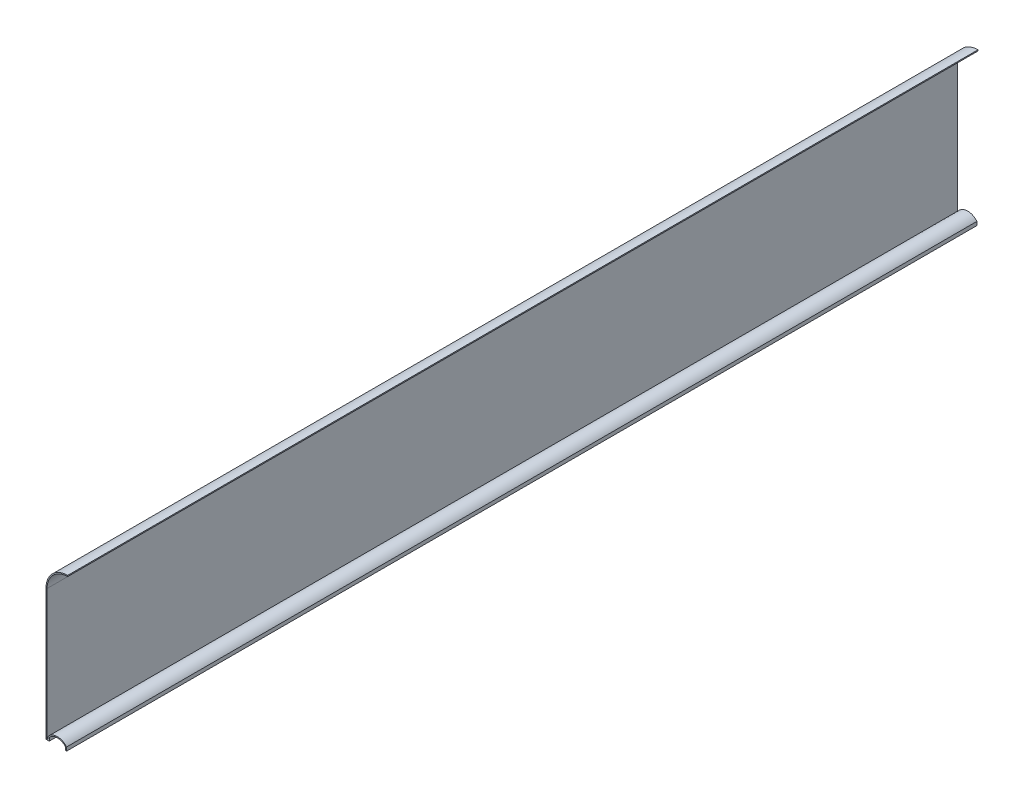
ISO-10303-21;
HEADER;
FILE_DESCRIPTION(('STEP AP214'),'2;1');
FILE_NAME('part.step','',(''),(''),'','','');
FILE_SCHEMA(('AUTOMOTIVE_DESIGN { 1 0 10303 214 1 1 1 1 }'));
ENDSEC;
DATA;
#1=APPLICATION_CONTEXT('core data for automotive mechanical design processes');
#2=APPLICATION_PROTOCOL_DEFINITION('international standard','automotive_design',2000,#1);
#3=PRODUCT_CONTEXT('',#1,'mechanical');
#4=PRODUCT('Part','Part','',(#3));
#5=PRODUCT_RELATED_PRODUCT_CATEGORY('part','',(#4));
#6=PRODUCT_DEFINITION_FORMATION('','',#4);
#7=PRODUCT_DEFINITION_CONTEXT('part definition',#1,'design');
#8=PRODUCT_DEFINITION('design','',#6,#7);
#9=PRODUCT_DEFINITION_SHAPE('','',#8);
#10=(LENGTH_UNIT() NAMED_UNIT(*) SI_UNIT(.MILLI.,.METRE.));
#11=(NAMED_UNIT(*) PLANE_ANGLE_UNIT() SI_UNIT($,.RADIAN.));
#12=(NAMED_UNIT(*) SI_UNIT($,.STERADIAN.) SOLID_ANGLE_UNIT());
#13=UNCERTAINTY_MEASURE_WITH_UNIT(LENGTH_MEASURE(1.E-05),#10,'distance_accuracy_value','');
#14=(GEOMETRIC_REPRESENTATION_CONTEXT(3) GLOBAL_UNCERTAINTY_ASSIGNED_CONTEXT((#13)) GLOBAL_UNIT_ASSIGNED_CONTEXT((#10,
#11,#12)) REPRESENTATION_CONTEXT('',''));
#15=CARTESIAN_POINT('',(0.,0.,0.));
#16=DIRECTION('',(0.,0.,1.));
#17=DIRECTION('',(1.,0.,0.));
#18=AXIS2_PLACEMENT_3D('',#15,#16,#17);
#19=CARTESIAN_POINT('',(1.7993799518643,0.,0.));
#20=DIRECTION('',(0.,0.,-1.));
#21=DIRECTION('',(0.,-1.,0.));
#22=AXIS2_PLACEMENT_3D('',#19,#20,#21);
#23=PLANE('',#22);
#24=DIRECTION('',(0.,-1.,0.));
#25=VECTOR('',#24,1.);
#26=CARTESIAN_POINT('',(1.7993799518643,0.,0.));
#27=LINE('',#26,#25);
#28=CARTESIAN_POINT('',(1.7993799518643,0.3,0.));
#29=VERTEX_POINT('',#28);
#30=CARTESIAN_POINT('',(1.7993799518643,0.,0.));
#31=VERTEX_POINT('',#30);
#32=EDGE_CURVE('E191',#29,#31,#27,.T.);
#33=ORIENTED_EDGE('',*,*,#32,.F.);
#34=CARTESIAN_POINT('',(1.04968997593215,-0.361789196033641,0.));
#35=DIRECTION('',(0.,0.,-1.));
#36=DIRECTION('',(-1.,0.,0.));
#37=AXIS2_PLACEMENT_3D('',#34,#35,#36);
#38=CIRCLE('',#37,1.);
#39=CARTESIAN_POINT('',(0.3,0.3,0.));
#40=VERTEX_POINT('',#39);
#41=EDGE_CURVE('E178',#40,#29,#38,.T.);
#42=ORIENTED_EDGE('',*,*,#41,.F.);
#43=DIRECTION('',(0.,1.,0.));
#44=VECTOR('',#43,1.);
#45=CARTESIAN_POINT('',(0.3,0.,0.));
#46=LINE('',#45,#44);
#47=CARTESIAN_POINT('',(0.3,0.,0.));
#48=VERTEX_POINT('',#47);
#49=EDGE_CURVE('E173',#48,#40,#46,.T.);
#50=ORIENTED_EDGE('',*,*,#49,.F.);
#51=DIRECTION('',(1.,0.,0.));
#52=VECTOR('',#51,1.);
#53=CARTESIAN_POINT('',(0.,0.,0.));
#54=LINE('',#53,#52);
#55=CARTESIAN_POINT('',(0.,0.,0.));
#56=VERTEX_POINT('',#55);
#57=EDGE_CURVE('E188',#56,#48,#54,.T.);
#58=ORIENTED_EDGE('',*,*,#57,.F.);
#59=DIRECTION('',(0.,-1.,0.));
#60=VECTOR('',#59,1.);
#61=CARTESIAN_POINT('',(0.,0.,0.));
#62=LINE('',#61,#60);
#63=CARTESIAN_POINT('',(0.,12.1,0.));
#64=VERTEX_POINT('',#63);
#65=EDGE_CURVE('E167',#64,#56,#62,.T.);
#66=ORIENTED_EDGE('',*,*,#65,.F.);
#67=CARTESIAN_POINT('',(2.,12.1,0.));
#68=DIRECTION('',(0.,0.,1.));
#69=DIRECTION('',(-1.,0.,0.));
#70=AXIS2_PLACEMENT_3D('',#67,#68,#69);
#71=CIRCLE('',#70,2.);
#72=CARTESIAN_POINT('',(2.,14.1,0.));
#73=VERTEX_POINT('',#72);
#74=EDGE_CURVE('E125',#73,#64,#71,.T.);
#75=ORIENTED_EDGE('',*,*,#74,.F.);
#76=DIRECTION('',(0.,1.,0.));
#77=VECTOR('',#76,1.);
#78=CARTESIAN_POINT('',(2.,14.1,0.));
#79=LINE('',#78,#77);
#80=CARTESIAN_POINT('',(2.,14.,0.));
#81=VERTEX_POINT('',#80);
#82=EDGE_CURVE('E11',#81,#73,#79,.T.);
#83=ORIENTED_EDGE('',*,*,#82,.F.);
#84=CARTESIAN_POINT('',(2.,12.1,0.));
#85=DIRECTION('',(0.,0.,1.));
#86=DIRECTION('',(1.,0.,0.));
#87=AXIS2_PLACEMENT_3D('',#84,#85,#86);
#88=CIRCLE('',#87,1.9);
#89=CARTESIAN_POINT('',(0.1,12.1,0.));
#90=VERTEX_POINT('',#89);
#91=EDGE_CURVE('E121',#81,#90,#88,.T.);
#92=ORIENTED_EDGE('',*,*,#91,.T.);
#93=DIRECTION('',(0.,1.,0.));
#94=VECTOR('',#93,1.);
#95=CARTESIAN_POINT('',(0.1,0.,0.));
#96=LINE('',#95,#94);
#97=CARTESIAN_POINT('',(0.1,0.1,0.));
#98=VERTEX_POINT('',#97);
#99=EDGE_CURVE('E146',#90,#98,#96,.F.);
#100=ORIENTED_EDGE('',*,*,#99,.T.);
#101=DIRECTION('',(1.,0.,0.));
#102=VECTOR('',#101,1.);
#103=CARTESIAN_POINT('',(0.,0.1,0.));
#104=LINE('',#103,#102);
#105=CARTESIAN_POINT('',(0.2,0.1,0.));
#106=VERTEX_POINT('',#105);
#107=EDGE_CURVE('E205',#98,#106,#104,.T.);
#108=ORIENTED_EDGE('',*,*,#107,.T.);
#109=DIRECTION('',(0.,1.,0.));
#110=VECTOR('',#109,1.);
#111=CARTESIAN_POINT('',(0.2,0.,0.));
#112=LINE('',#111,#110);
#113=CARTESIAN_POINT('',(0.2,0.336800057247873,0.));
#114=VERTEX_POINT('',#113);
#115=EDGE_CURVE('E209',#106,#114,#112,.T.);
#116=ORIENTED_EDGE('',*,*,#115,.T.);
#117=CARTESIAN_POINT('',(1.04968997593215,-0.361789196033641,0.));
#118=DIRECTION('',(0.,0.,1.));
#119=DIRECTION('',(1.,0.,0.));
#120=AXIS2_PLACEMENT_3D('',#117,#118,#119);
#121=CIRCLE('',#120,1.1);
#122=CARTESIAN_POINT('',(1.8993799518643,0.336800057247873,0.));
#123=VERTEX_POINT('',#122);
#124=EDGE_CURVE('E213',#114,#123,#121,.F.);
#125=ORIENTED_EDGE('',*,*,#124,.T.);
#126=DIRECTION('',(0.,1.,0.));
#127=VECTOR('',#126,1.);
#128=CARTESIAN_POINT('',(1.8993799518643,0.,0.));
#129=LINE('',#128,#127);
#130=CARTESIAN_POINT('',(1.8993799518643,0.,0.));
#131=VERTEX_POINT('',#130);
#132=EDGE_CURVE('E217',#123,#131,#129,.F.);
#133=ORIENTED_EDGE('',*,*,#132,.T.);
#134=DIRECTION('',(-1.,0.,0.));
#135=VECTOR('',#134,1.);
#136=CARTESIAN_POINT('',(1.7993799518643,0.,0.));
#137=LINE('',#136,#135);
#138=EDGE_CURVE('E44',#131,#31,#137,.T.);
#139=ORIENTED_EDGE('',*,*,#138,.T.);
#140=EDGE_LOOP('',(#33,#42,#50,#58,#66,#75,#83,#92,#100,#108,#116,#125,#133,#139));
#141=FACE_BOUND('',#140,.T.);
#142=ADVANCED_FACE('F34',(#141),#23,.T.);
#143=CARTESIAN_POINT('',(1.7993799518643,0.,0.));
#144=DIRECTION('',(0.,-1.,0.));
#145=DIRECTION('',(0.,0.,1.));
#146=AXIS2_PLACEMENT_3D('',#143,#144,#145);
#147=PLANE('',#146);
#148=ORIENTED_EDGE('',*,*,#138,.F.);
#149=DIRECTION('',(0.,0.,1.));
#150=VECTOR('',#149,1.);
#151=CARTESIAN_POINT('',(1.8993799518643,0.,0.));
#152=LINE('',#151,#150);
#153=CARTESIAN_POINT('',(1.8993799518643,0.,84.));
#154=VERTEX_POINT('',#153);
#155=EDGE_CURVE('E228',#131,#154,#152,.T.);
#156=ORIENTED_EDGE('',*,*,#155,.T.);
#157=DIRECTION('',(-1.,0.,0.));
#158=VECTOR('',#157,1.);
#159=CARTESIAN_POINT('',(1.7993799518643,0.,84.));
#160=LINE('',#159,#158);
#161=CARTESIAN_POINT('',(1.7993799518643,0.,84.));
#162=VERTEX_POINT('',#161);
#163=EDGE_CURVE('E149',#154,#162,#160,.T.);
#164=ORIENTED_EDGE('',*,*,#163,.T.);
#165=DIRECTION('',(0.,0.,1.));
#166=VECTOR('',#165,1.);
#167=CARTESIAN_POINT('',(1.7993799518643,0.,0.));
#168=LINE('',#167,#166);
#169=EDGE_CURVE('E182',#31,#162,#168,.T.);
#170=ORIENTED_EDGE('',*,*,#169,.F.);
#171=EDGE_LOOP('',(#148,#156,#164,#170));
#172=FACE_BOUND('',#171,.T.);
#173=ADVANCED_FACE('F254',(#172),#147,.T.);
#174=CARTESIAN_POINT('',(2.,12.1,84.));
#175=DIRECTION('',(0.,0.,-1.));
#176=DIRECTION('',(-1.,0.,0.));
#177=AXIS2_PLACEMENT_3D('',#174,#175,#176);
#178=PLANE('',#177);
#179=CARTESIAN_POINT('',(2.,12.1,84.));
#180=DIRECTION('',(0.,0.,1.));
#181=DIRECTION('',(-1.,0.,0.));
#182=AXIS2_PLACEMENT_3D('',#179,#180,#181);
#183=CIRCLE('',#182,2.);
#184=CARTESIAN_POINT('',(2.,14.1,84.));
#185=VERTEX_POINT('',#184);
#186=CARTESIAN_POINT('',(0.,12.1,84.));
#187=VERTEX_POINT('',#186);
#188=EDGE_CURVE('E163',#185,#187,#183,.T.);
#189=ORIENTED_EDGE('',*,*,#188,.T.);
#190=DIRECTION('',(0.,-1.,0.));
#191=VECTOR('',#190,1.);
#192=CARTESIAN_POINT('',(0.,0.,84.));
#193=LINE('',#192,#191);
#194=CARTESIAN_POINT('',(0.,0.,84.));
#195=VERTEX_POINT('',#194);
#196=EDGE_CURVE('E184',#187,#195,#193,.T.);
#197=ORIENTED_EDGE('',*,*,#196,.T.);
#198=DIRECTION('',(1.,0.,0.));
#199=VECTOR('',#198,1.);
#200=CARTESIAN_POINT('',(0.,0.,84.));
#201=LINE('',#200,#199);
#202=CARTESIAN_POINT('',(0.3,0.,84.));
#203=VERTEX_POINT('',#202);
#204=EDGE_CURVE('E169',#195,#203,#201,.T.);
#205=ORIENTED_EDGE('',*,*,#204,.T.);
#206=DIRECTION('',(0.,1.,0.));
#207=VECTOR('',#206,1.);
#208=CARTESIAN_POINT('',(0.3,0.,84.));
#209=LINE('',#208,#207);
#210=CARTESIAN_POINT('',(0.3,0.3,84.));
#211=VERTEX_POINT('',#210);
#212=EDGE_CURVE('E174',#203,#211,#209,.T.);
#213=ORIENTED_EDGE('',*,*,#212,.T.);
#214=CARTESIAN_POINT('',(1.04968997593215,-0.361789196033641,84.));
#215=DIRECTION('',(0.,0.,-1.));
#216=DIRECTION('',(-1.,0.,0.));
#217=AXIS2_PLACEMENT_3D('',#214,#215,#216);
#218=CIRCLE('',#217,1.);
#219=CARTESIAN_POINT('',(1.7993799518643,0.3,84.));
#220=VERTEX_POINT('',#219);
#221=EDGE_CURVE('E179',#211,#220,#218,.T.);
#222=ORIENTED_EDGE('',*,*,#221,.T.);
#223=DIRECTION('',(0.,-1.,0.));
#224=VECTOR('',#223,1.);
#225=CARTESIAN_POINT('',(1.7993799518643,0.,84.));
#226=LINE('',#225,#224);
#227=EDGE_CURVE('E140',#220,#162,#226,.T.);
#228=ORIENTED_EDGE('',*,*,#227,.T.);
#229=ORIENTED_EDGE('',*,*,#163,.F.);
#230=DIRECTION('',(0.,1.,0.));
#231=VECTOR('',#230,1.);
#232=CARTESIAN_POINT('',(1.8993799518643,0.,84.));
#233=LINE('',#232,#231);
#234=CARTESIAN_POINT('',(1.8993799518643,0.336800057247873,84.));
#235=VERTEX_POINT('',#234);
#236=EDGE_CURVE('E218',#235,#154,#233,.F.);
#237=ORIENTED_EDGE('',*,*,#236,.F.);
#238=CARTESIAN_POINT('',(1.04968997593215,-0.361789196033641,84.));
#239=DIRECTION('',(0.,0.,1.));
#240=DIRECTION('',(1.,0.,0.));
#241=AXIS2_PLACEMENT_3D('',#238,#239,#240);
#242=CIRCLE('',#241,1.1);
#243=CARTESIAN_POINT('',(0.2,0.336800057247873,84.));
#244=VERTEX_POINT('',#243);
#245=EDGE_CURVE('E214',#244,#235,#242,.F.);
#246=ORIENTED_EDGE('',*,*,#245,.F.);
#247=DIRECTION('',(0.,1.,0.));
#248=VECTOR('',#247,1.);
#249=CARTESIAN_POINT('',(0.2,0.,84.));
#250=LINE('',#249,#248);
#251=CARTESIAN_POINT('',(0.2,0.1,84.));
#252=VERTEX_POINT('',#251);
#253=EDGE_CURVE('E210',#252,#244,#250,.T.);
#254=ORIENTED_EDGE('',*,*,#253,.F.);
#255=DIRECTION('',(1.,0.,0.));
#256=VECTOR('',#255,1.);
#257=CARTESIAN_POINT('',(0.,0.1,84.));
#258=LINE('',#257,#256);
#259=CARTESIAN_POINT('',(0.1,0.1,84.));
#260=VERTEX_POINT('',#259);
#261=EDGE_CURVE('E206',#260,#252,#258,.T.);
#262=ORIENTED_EDGE('',*,*,#261,.F.);
#263=DIRECTION('',(0.,1.,0.));
#264=VECTOR('',#263,1.);
#265=CARTESIAN_POINT('',(0.1,0.,84.));
#266=LINE('',#265,#264);
#267=CARTESIAN_POINT('',(0.1,12.1,84.));
#268=VERTEX_POINT('',#267);
#269=EDGE_CURVE('E202',#268,#260,#266,.F.);
#270=ORIENTED_EDGE('',*,*,#269,.F.);
#271=CARTESIAN_POINT('',(2.,12.1,84.));
#272=DIRECTION('',(0.,0.,1.));
#273=DIRECTION('',(1.,0.,0.));
#274=AXIS2_PLACEMENT_3D('',#271,#272,#273);
#275=CIRCLE('',#274,1.9);
#276=CARTESIAN_POINT('',(2.,14.,84.));
#277=VERTEX_POINT('',#276);
#278=EDGE_CURVE('E135',#277,#268,#275,.T.);
#279=ORIENTED_EDGE('',*,*,#278,.F.);
#280=DIRECTION('',(0.,1.,0.));
#281=VECTOR('',#280,1.);
#282=CARTESIAN_POINT('',(2.,14.1,84.));
#283=LINE('',#282,#281);
#284=EDGE_CURVE('E38',#277,#185,#283,.T.);
#285=ORIENTED_EDGE('',*,*,#284,.T.);
#286=EDGE_LOOP('',(#189,#197,#205,#213,#222,#228,#229,#237,#246,#254,#262,#270,#279,#285));
#287=FACE_BOUND('',#286,.T.);
#288=ADVANCED_FACE('F258',(#287),#178,.F.);
#289=CARTESIAN_POINT('',(2.,14.1,42.));
#290=DIRECTION('',(-1.,0.,0.));
#291=DIRECTION('',(0.,0.,1.));
#292=AXIS2_PLACEMENT_3D('',#289,#290,#291);
#293=PLANE('',#292);
#294=DIRECTION('',(0.,0.,1.));
#295=VECTOR('',#294,1.);
#296=CARTESIAN_POINT('',(2.,14.,0.));
#297=LINE('',#296,#295);
#298=EDGE_CURVE('E131',#81,#277,#297,.T.);
#299=ORIENTED_EDGE('',*,*,#298,.F.);
#300=ORIENTED_EDGE('',*,*,#82,.T.);
#301=DIRECTION('',(0.,0.,1.));
#302=VECTOR('',#301,1.);
#303=CARTESIAN_POINT('',(2.,14.1,0.));
#304=LINE('',#303,#302);
#305=EDGE_CURVE('E158',#73,#185,#304,.T.);
#306=ORIENTED_EDGE('',*,*,#305,.T.);
#307=ORIENTED_EDGE('',*,*,#284,.F.);
#308=EDGE_LOOP('',(#299,#300,#306,#307));
#309=FACE_BOUND('',#308,.T.);
#310=ADVANCED_FACE('F36',(#309),#293,.F.);
#311=CARTESIAN_POINT('',(2.,12.1,0.));
#312=DIRECTION('',(0.,0.,1.));
#313=DIRECTION('',(1.,0.,0.));
#314=AXIS2_PLACEMENT_3D('',#311,#312,#313);
#315=CYLINDRICAL_SURFACE('',#314,2.);
#316=ORIENTED_EDGE('',*,*,#188,.F.);
#317=ORIENTED_EDGE('',*,*,#305,.F.);
#318=ORIENTED_EDGE('',*,*,#74,.T.);
#319=DIRECTION('',(0.,0.,1.));
#320=VECTOR('',#319,1.);
#321=CARTESIAN_POINT('',(0.,12.1,0.));
#322=LINE('',#321,#320);
#323=EDGE_CURVE('E187',#64,#187,#322,.T.);
#324=ORIENTED_EDGE('',*,*,#323,.T.);
#325=EDGE_LOOP('',(#316,#317,#318,#324));
#326=FACE_BOUND('',#325,.T.);
#327=ADVANCED_FACE('F285',(#326),#315,.T.);
#328=CARTESIAN_POINT('',(0.,0.,0.));
#329=DIRECTION('',(-1.,0.,0.));
#330=DIRECTION('',(0.,0.,1.));
#331=AXIS2_PLACEMENT_3D('',#328,#329,#330);
#332=PLANE('',#331);
#333=ORIENTED_EDGE('',*,*,#196,.F.);
#334=ORIENTED_EDGE('',*,*,#323,.F.);
#335=ORIENTED_EDGE('',*,*,#65,.T.);
#336=DIRECTION('',(0.,0.,1.));
#337=VECTOR('',#336,1.);
#338=CARTESIAN_POINT('',(0.,0.,0.));
#339=LINE('',#338,#337);
#340=EDGE_CURVE('E172',#56,#195,#339,.T.);
#341=ORIENTED_EDGE('',*,*,#340,.T.);
#342=EDGE_LOOP('',(#333,#334,#335,#341));
#343=FACE_BOUND('',#342,.T.);
#344=ADVANCED_FACE('F281',(#343),#332,.T.);
#345=CARTESIAN_POINT('',(0.,0.,0.));
#346=DIRECTION('',(0.,-1.,0.));
#347=DIRECTION('',(0.,0.,-1.));
#348=AXIS2_PLACEMENT_3D('',#345,#346,#347);
#349=PLANE('',#348);
#350=ORIENTED_EDGE('',*,*,#204,.F.);
#351=ORIENTED_EDGE('',*,*,#340,.F.);
#352=ORIENTED_EDGE('',*,*,#57,.T.);
#353=DIRECTION('',(0.,0.,1.));
#354=VECTOR('',#353,1.);
#355=CARTESIAN_POINT('',(0.3,0.,0.));
#356=LINE('',#355,#354);
#357=EDGE_CURVE('E177',#48,#203,#356,.T.);
#358=ORIENTED_EDGE('',*,*,#357,.T.);
#359=EDGE_LOOP('',(#350,#351,#352,#358));
#360=FACE_BOUND('',#359,.T.);
#361=ADVANCED_FACE('F273',(#360),#349,.T.);
#362=CARTESIAN_POINT('',(0.3,0.,0.));
#363=DIRECTION('',(1.,0.,0.));
#364=DIRECTION('',(0.,1.,0.));
#365=AXIS2_PLACEMENT_3D('',#362,#363,#364);
#366=PLANE('',#365);
#367=ORIENTED_EDGE('',*,*,#212,.F.);
#368=ORIENTED_EDGE('',*,*,#357,.F.);
#369=ORIENTED_EDGE('',*,*,#49,.T.);
#370=DIRECTION('',(0.,0.,1.));
#371=VECTOR('',#370,1.);
#372=CARTESIAN_POINT('',(0.3,0.3,0.));
#373=LINE('',#372,#371);
#374=EDGE_CURVE('E181',#40,#211,#373,.T.);
#375=ORIENTED_EDGE('',*,*,#374,.T.);
#376=EDGE_LOOP('',(#367,#368,#369,#375));
#377=FACE_BOUND('',#376,.T.);
#378=ADVANCED_FACE('F278',(#377),#366,.T.);
#379=CARTESIAN_POINT('',(1.04968997593215,-0.361789196033641,0.));
#380=DIRECTION('',(0.,0.,1.));
#381=DIRECTION('',(1.,0.,0.));
#382=AXIS2_PLACEMENT_3D('',#379,#380,#381);
#383=CYLINDRICAL_SURFACE('',#382,1.);
#384=ORIENTED_EDGE('',*,*,#221,.F.);
#385=ORIENTED_EDGE('',*,*,#374,.F.);
#386=ORIENTED_EDGE('',*,*,#41,.T.);
#387=DIRECTION('',(0.,0.,1.));
#388=VECTOR('',#387,1.);
#389=CARTESIAN_POINT('',(1.7993799518643,0.3,0.));
#390=LINE('',#389,#388);
#391=EDGE_CURVE('E143',#29,#220,#390,.T.);
#392=ORIENTED_EDGE('',*,*,#391,.T.);
#393=EDGE_LOOP('',(#384,#385,#386,#392));
#394=FACE_BOUND('',#393,.T.);
#395=ADVANCED_FACE('F261',(#394),#383,.F.);
#396=CARTESIAN_POINT('',(1.7993799518643,0.,0.));
#397=DIRECTION('',(-1.,0.,0.));
#398=DIRECTION('',(0.,0.,1.));
#399=AXIS2_PLACEMENT_3D('',#396,#397,#398);
#400=PLANE('',#399);
#401=ORIENTED_EDGE('',*,*,#227,.F.);
#402=ORIENTED_EDGE('',*,*,#391,.F.);
#403=ORIENTED_EDGE('',*,*,#32,.T.);
#404=ORIENTED_EDGE('',*,*,#169,.T.);
#405=EDGE_LOOP('',(#401,#402,#403,#404));
#406=FACE_BOUND('',#405,.T.);
#407=ADVANCED_FACE('F256',(#406),#400,.T.);
#408=CARTESIAN_POINT('',(2.,12.1,0.));
#409=DIRECTION('',(0.,0.,1.));
#410=DIRECTION('',(1.,0.,0.));
#411=AXIS2_PLACEMENT_3D('',#408,#409,#410);
#412=CYLINDRICAL_SURFACE('',#411,1.9);
#413=ORIENTED_EDGE('',*,*,#278,.T.);
#414=DIRECTION('',(0.,0.,1.));
#415=VECTOR('',#414,1.);
#416=CARTESIAN_POINT('',(0.1,12.1,0.));
#417=LINE('',#416,#415);
#418=EDGE_CURVE('E138',#90,#268,#417,.T.);
#419=ORIENTED_EDGE('',*,*,#418,.F.);
#420=ORIENTED_EDGE('',*,*,#91,.F.);
#421=ORIENTED_EDGE('',*,*,#298,.T.);
#422=EDGE_LOOP('',(#413,#419,#420,#421));
#423=FACE_BOUND('',#422,.T.);
#424=ADVANCED_FACE('F137',(#423),#412,.F.);
#425=CARTESIAN_POINT('',(0.1,0.,0.));
#426=DIRECTION('',(-1.,0.,0.));
#427=DIRECTION('',(0.,0.,1.));
#428=AXIS2_PLACEMENT_3D('',#425,#426,#427);
#429=PLANE('',#428);
#430=ORIENTED_EDGE('',*,*,#269,.T.);
#431=DIRECTION('',(0.,0.,1.));
#432=VECTOR('',#431,1.);
#433=CARTESIAN_POINT('',(0.1,0.1,0.));
#434=LINE('',#433,#432);
#435=EDGE_CURVE('E203',#98,#260,#434,.T.);
#436=ORIENTED_EDGE('',*,*,#435,.F.);
#437=ORIENTED_EDGE('',*,*,#99,.F.);
#438=ORIENTED_EDGE('',*,*,#418,.T.);
#439=EDGE_LOOP('',(#430,#436,#437,#438));
#440=FACE_BOUND('',#439,.T.);
#441=ADVANCED_FACE('F310',(#440),#429,.F.);
#442=CARTESIAN_POINT('',(0.,0.1,0.));
#443=DIRECTION('',(0.,-1.,0.));
#444=DIRECTION('',(0.,0.,-1.));
#445=AXIS2_PLACEMENT_3D('',#442,#443,#444);
#446=PLANE('',#445);
#447=ORIENTED_EDGE('',*,*,#261,.T.);
#448=DIRECTION('',(0.,0.,1.));
#449=VECTOR('',#448,1.);
#450=CARTESIAN_POINT('',(0.2,0.1,0.));
#451=LINE('',#450,#449);
#452=EDGE_CURVE('E207',#106,#252,#451,.T.);
#453=ORIENTED_EDGE('',*,*,#452,.F.);
#454=ORIENTED_EDGE('',*,*,#107,.F.);
#455=ORIENTED_EDGE('',*,*,#435,.T.);
#456=EDGE_LOOP('',(#447,#453,#454,#455));
#457=FACE_BOUND('',#456,.T.);
#458=ADVANCED_FACE('F240',(#457),#446,.F.);
#459=CARTESIAN_POINT('',(0.2,0.,0.));
#460=DIRECTION('',(1.,0.,0.));
#461=DIRECTION('',(0.,1.,0.));
#462=AXIS2_PLACEMENT_3D('',#459,#460,#461);
#463=PLANE('',#462);
#464=ORIENTED_EDGE('',*,*,#253,.T.);
#465=DIRECTION('',(0.,0.,1.));
#466=VECTOR('',#465,1.);
#467=CARTESIAN_POINT('',(0.2,0.336800057247873,0.));
#468=LINE('',#467,#466);
#469=EDGE_CURVE('E211',#114,#244,#468,.T.);
#470=ORIENTED_EDGE('',*,*,#469,.F.);
#471=ORIENTED_EDGE('',*,*,#115,.F.);
#472=ORIENTED_EDGE('',*,*,#452,.T.);
#473=EDGE_LOOP('',(#464,#470,#471,#472));
#474=FACE_BOUND('',#473,.T.);
#475=ADVANCED_FACE('F244',(#474),#463,.F.);
#476=CARTESIAN_POINT('',(1.04968997593215,-0.361789196033641,0.));
#477=DIRECTION('',(0.,0.,1.));
#478=DIRECTION('',(1.,0.,0.));
#479=AXIS2_PLACEMENT_3D('',#476,#477,#478);
#480=CYLINDRICAL_SURFACE('',#479,1.1);
#481=ORIENTED_EDGE('',*,*,#245,.T.);
#482=DIRECTION('',(0.,0.,1.));
#483=VECTOR('',#482,1.);
#484=CARTESIAN_POINT('',(1.8993799518643,0.336800057247873,0.));
#485=LINE('',#484,#483);
#486=EDGE_CURVE('E215',#123,#235,#485,.T.);
#487=ORIENTED_EDGE('',*,*,#486,.F.);
#488=ORIENTED_EDGE('',*,*,#124,.F.);
#489=ORIENTED_EDGE('',*,*,#469,.T.);
#490=EDGE_LOOP('',(#481,#487,#488,#489));
#491=FACE_BOUND('',#490,.T.);
#492=ADVANCED_FACE('F248',(#491),#480,.T.);
#493=CARTESIAN_POINT('',(1.8993799518643,0.,0.));
#494=DIRECTION('',(-1.,0.,0.));
#495=DIRECTION('',(0.,0.,1.));
#496=AXIS2_PLACEMENT_3D('',#493,#494,#495);
#497=PLANE('',#496);
#498=ORIENTED_EDGE('',*,*,#236,.T.);
#499=ORIENTED_EDGE('',*,*,#155,.F.);
#500=ORIENTED_EDGE('',*,*,#132,.F.);
#501=ORIENTED_EDGE('',*,*,#486,.T.);
#502=EDGE_LOOP('',(#498,#499,#500,#501));
#503=FACE_BOUND('',#502,.T.);
#504=ADVANCED_FACE('F252',(#503),#497,.F.);
#505=CLOSED_SHELL('',(#142,#173,#288,#310,#327,#344,#361,#378,#395,#407,#424,#441,#458,#475,
#492,#504));
#506=MANIFOLD_SOLID_BREP('B2',#505);
#507=ADVANCED_BREP_SHAPE_REPRESENTATION('',(#18,#506),#14);
#508=SHAPE_DEFINITION_REPRESENTATION(#9,#507);
ENDSEC;
END-ISO-10303-21;
